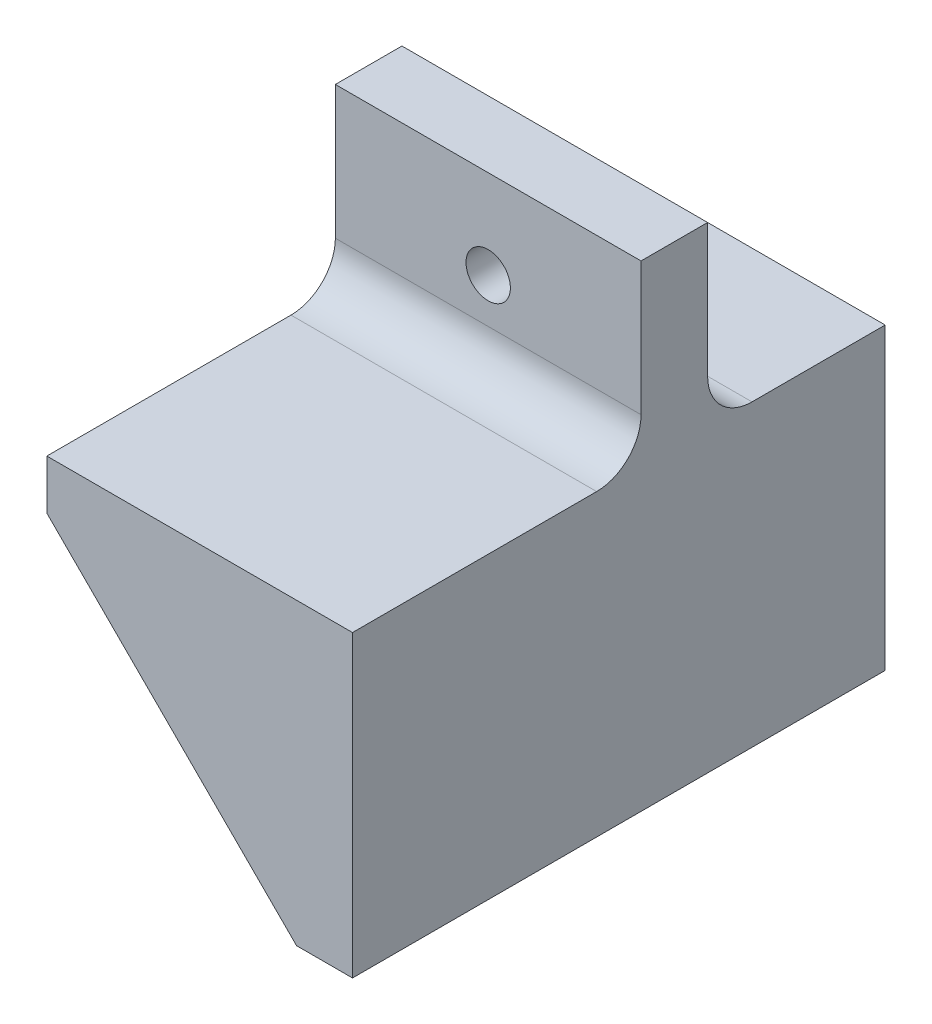
ISO-10303-21;
HEADER;
FILE_DESCRIPTION(('STEP AP214'),'2;1');
FILE_NAME('part.step','',(''),(''),'','','');
FILE_SCHEMA(('AUTOMOTIVE_DESIGN { 1 0 10303 214 1 1 1 1 }'));
ENDSEC;
DATA;
#1=APPLICATION_CONTEXT('core data for automotive mechanical design processes');
#2=APPLICATION_PROTOCOL_DEFINITION('international standard','automotive_design',2000,#1);
#3=PRODUCT_CONTEXT('',#1,'mechanical');
#4=PRODUCT('Part','Part','',(#3));
#5=PRODUCT_RELATED_PRODUCT_CATEGORY('part','',(#4));
#6=PRODUCT_DEFINITION_FORMATION('','',#4);
#7=PRODUCT_DEFINITION_CONTEXT('part definition',#1,'design');
#8=PRODUCT_DEFINITION('design','',#6,#7);
#9=PRODUCT_DEFINITION_SHAPE('','',#8);
#10=(LENGTH_UNIT() NAMED_UNIT(*) SI_UNIT(.MILLI.,.METRE.));
#11=(NAMED_UNIT(*) PLANE_ANGLE_UNIT() SI_UNIT($,.RADIAN.));
#12=(NAMED_UNIT(*) SI_UNIT($,.STERADIAN.) SOLID_ANGLE_UNIT());
#13=UNCERTAINTY_MEASURE_WITH_UNIT(LENGTH_MEASURE(1.E-05),#10,'distance_accuracy_value','');
#14=(GEOMETRIC_REPRESENTATION_CONTEXT(3) GLOBAL_UNCERTAINTY_ASSIGNED_CONTEXT((#13)) GLOBAL_UNIT_ASSIGNED_CONTEXT((#10,
#11,#12)) REPRESENTATION_CONTEXT('',''));
#15=CARTESIAN_POINT('',(0.,0.,0.));
#16=DIRECTION('',(0.,0.,1.));
#17=DIRECTION('',(1.,0.,0.));
#18=AXIS2_PLACEMENT_3D('',#15,#16,#17);
#19=CARTESIAN_POINT('',(-19.9589678162416,21.0060806108814,76.2));
#20=DIRECTION('',(0.,-1.,0.));
#21=DIRECTION('',(0.,0.,1.));
#22=AXIS2_PLACEMENT_3D('',#19,#20,#21);
#23=PLANE('',#22);
#24=CARTESIAN_POINT('',(8.97656608969118,21.0060806108814,12.7));
#25=DIRECTION('',(0.,1.,0.));
#26=DIRECTION('',(0.,0.,1.));
#27=AXIS2_PLACEMENT_3D('',#24,#25,#26);
#28=CIRCLE('',#27,3.17499999999999);
#29=CARTESIAN_POINT('',(8.97656608969118,21.0060806108814,15.875));
#30=VERTEX_POINT('',#29);
#31=EDGE_CURVE('E197',#30,#30,#28,.T.);
#32=ORIENTED_EDGE('',*,*,#31,.F.);
#33=EDGE_LOOP('',(#32));
#34=FACE_BOUND('',#33,.T.);
#35=DIRECTION('',(0.,0.,-1.));
#36=VECTOR('',#35,1.);
#37=CARTESIAN_POINT('',(30.8410321837584,21.0060806108814,76.2));
#38=LINE('',#37,#36);
#39=CARTESIAN_POINT('',(30.8410321837584,21.0060806108814,19.05));
#40=VERTEX_POINT('',#39);
#41=CARTESIAN_POINT('',(30.8410321837584,21.0060806108814,0.));
#42=VERTEX_POINT('',#41);
#43=EDGE_CURVE('E235',#40,#42,#38,.T.);
#44=ORIENTED_EDGE('',*,*,#43,.T.);
#45=DIRECTION('',(1.,0.,0.));
#46=VECTOR('',#45,1.);
#47=CARTESIAN_POINT('',(-19.9589678162416,21.0060806108814,0.));
#48=LINE('',#47,#46);
#49=CARTESIAN_POINT('',(-12.8879000043761,21.0060806108814,0.));
#50=VERTEX_POINT('',#49);
#51=EDGE_CURVE('E227',#50,#42,#48,.T.);
#52=ORIENTED_EDGE('',*,*,#51,.F.);
#53=DIRECTION('',(0.,0.,-1.));
#54=VECTOR('',#53,1.);
#55=CARTESIAN_POINT('',(-12.8879000043761,21.0060806108814,76.2));
#56=LINE('',#55,#54);
#57=CARTESIAN_POINT('',(-12.8879000043761,21.0060806108814,19.05));
#58=VERTEX_POINT('',#57);
#59=EDGE_CURVE('E289',#58,#50,#56,.T.);
#60=ORIENTED_EDGE('',*,*,#59,.F.);
#61=DIRECTION('',(1.,0.,0.));
#62=VECTOR('',#61,1.);
#63=CARTESIAN_POINT('',(-12.8879000043761,21.0060806108814,19.05));
#64=LINE('',#63,#62);
#65=EDGE_CURVE('E307',#40,#58,#64,.F.);
#66=ORIENTED_EDGE('',*,*,#65,.F.);
#67=EDGE_LOOP('',(#44,#52,#60,#66));
#68=FACE_BOUND('',#67,.T.);
#69=ADVANCED_FACE('F44',(#34,#68),#23,.F.);
#70=CARTESIAN_POINT('',(-12.8879000043761,21.0060806108814,76.2));
#71=VERTEX_POINT('',#70);
#72=CARTESIAN_POINT('',(-12.8879000043761,21.0060806108814,41.275));
#73=VERTEX_POINT('',#72);
#74=EDGE_CURVE('E290',#71,#73,#56,.T.);
#75=ORIENTED_EDGE('',*,*,#74,.F.);
#76=DIRECTION('',(1.,0.,0.));
#77=VECTOR('',#76,1.);
#78=CARTESIAN_POINT('',(-19.9589678162416,21.0060806108814,76.2));
#79=LINE('',#78,#77);
#80=CARTESIAN_POINT('',(30.8410321837584,21.0060806108814,76.2));
#81=VERTEX_POINT('',#80);
#82=EDGE_CURVE('E231',#71,#81,#79,.T.);
#83=ORIENTED_EDGE('',*,*,#82,.T.);
#84=CARTESIAN_POINT('',(30.8410321837584,21.0060806108814,41.275));
#85=VERTEX_POINT('',#84);
#86=EDGE_CURVE('E246',#81,#85,#38,.T.);
#87=ORIENTED_EDGE('',*,*,#86,.T.);
#88=DIRECTION('',(-1.,0.,0.));
#89=VECTOR('',#88,1.);
#90=CARTESIAN_POINT('',(30.8410321837584,21.0060806108814,41.275));
#91=LINE('',#90,#89);
#92=EDGE_CURVE('E313',#73,#85,#91,.F.);
#93=ORIENTED_EDGE('',*,*,#92,.F.);
#94=EDGE_LOOP('',(#75,#83,#87,#93));
#95=FACE_BOUND('',#94,.T.);
#96=ADVANCED_FACE('F347',(#95),#23,.F.);
#97=CARTESIAN_POINT('',(30.8410321837584,-29.7939193891186,76.2));
#98=DIRECTION('',(-1.,0.,0.));
#99=DIRECTION('',(0.,1.,0.));
#100=AXIS2_PLACEMENT_3D('',#97,#98,#99);
#101=PLANE('',#100);
#102=DIRECTION('',(0.,-1.,0.));
#103=VECTOR('',#102,1.);
#104=CARTESIAN_POINT('',(30.8410321837584,-29.7939193891186,0.));
#105=LINE('',#104,#103);
#106=CARTESIAN_POINT('',(30.8410321837584,-21.7939193891185,0.));
#107=VERTEX_POINT('',#106);
#108=EDGE_CURVE('E218',#42,#107,#105,.T.);
#109=ORIENTED_EDGE('',*,*,#108,.F.);
#110=ORIENTED_EDGE('',*,*,#43,.F.);
#111=CARTESIAN_POINT('',(30.8410321837584,27.3560806108814,19.05));
#112=DIRECTION('',(1.,0.,0.));
#113=DIRECTION('',(0.,1.,0.));
#114=AXIS2_PLACEMENT_3D('',#111,#112,#113);
#115=CIRCLE('',#114,6.35);
#116=CARTESIAN_POINT('',(30.8410321837584,27.3560806108814,25.4));
#117=VERTEX_POINT('',#116);
#118=EDGE_CURVE('E316',#117,#40,#115,.T.);
#119=ORIENTED_EDGE('',*,*,#118,.F.);
#120=DIRECTION('',(0.,-1.,0.));
#121=VECTOR('',#120,1.);
#122=CARTESIAN_POINT('',(30.8410321837584,46.4060806108814,25.4));
#123=LINE('',#122,#121);
#124=CARTESIAN_POINT('',(30.8410321837584,46.4060806108814,25.4));
#125=VERTEX_POINT('',#124);
#126=EDGE_CURVE('E174',#125,#117,#123,.T.);
#127=ORIENTED_EDGE('',*,*,#126,.F.);
#128=DIRECTION('',(0.,0.,1.));
#129=VECTOR('',#128,1.);
#130=CARTESIAN_POINT('',(30.8410321837584,46.4060806108814,25.4));
#131=LINE('',#130,#129);
#132=CARTESIAN_POINT('',(30.8410321837584,46.4060806108814,34.925));
#133=VERTEX_POINT('',#132);
#134=EDGE_CURVE('E155',#125,#133,#131,.T.);
#135=ORIENTED_EDGE('',*,*,#134,.T.);
#136=DIRECTION('',(0.,-1.,0.));
#137=VECTOR('',#136,1.);
#138=CARTESIAN_POINT('',(30.8410321837584,46.4060806108814,34.925));
#139=LINE('',#138,#137);
#140=CARTESIAN_POINT('',(30.8410321837584,27.3560806108814,34.925));
#141=VERTEX_POINT('',#140);
#142=EDGE_CURVE('E164',#133,#141,#139,.T.);
#143=ORIENTED_EDGE('',*,*,#142,.T.);
#144=CARTESIAN_POINT('',(30.8410321837584,27.3560806108814,41.275));
#145=DIRECTION('',(1.,0.,0.));
#146=DIRECTION('',(0.,1.,0.));
#147=AXIS2_PLACEMENT_3D('',#144,#145,#146);
#148=CIRCLE('',#147,6.35);
#149=EDGE_CURVE('E11',#85,#141,#148,.T.);
#150=ORIENTED_EDGE('',*,*,#149,.F.);
#151=ORIENTED_EDGE('',*,*,#86,.F.);
#152=DIRECTION('',(0.,-1.,0.));
#153=VECTOR('',#152,1.);
#154=CARTESIAN_POINT('',(30.8410321837584,-29.7939193891186,76.2));
#155=LINE('',#154,#153);
#156=CARTESIAN_POINT('',(30.8410321837584,-21.7939193891185,76.2));
#157=VERTEX_POINT('',#156);
#158=EDGE_CURVE('E222',#81,#157,#155,.T.);
#159=ORIENTED_EDGE('',*,*,#158,.T.);
#160=DIRECTION('',(0.,0.,1.));
#161=VECTOR('',#160,1.);
#162=CARTESIAN_POINT('',(30.8410321837584,-21.7939193891185,76.2));
#163=LINE('',#162,#161);
#164=EDGE_CURVE('E282',#107,#157,#163,.T.);
#165=ORIENTED_EDGE('',*,*,#164,.F.);
#166=EDGE_LOOP('',(#109,#110,#119,#127,#135,#143,#150,#151,#159,#165));
#167=FACE_BOUND('',#166,.T.);
#168=ADVANCED_FACE('F171',(#167),#101,.F.);
#169=CARTESIAN_POINT('',(30.8410321837584,-29.7939193891186,76.2));
#170=DIRECTION('',(0.707106781186548,0.707106781186547,0.));
#171=DIRECTION('',(0.707106781186547,-0.707106781186548,0.));
#172=AXIS2_PLACEMENT_3D('',#169,#170,#171);
#173=PLANE('',#172);
#174=DIRECTION('',(-0.707106781186547,0.707106781186548,0.));
#175=VECTOR('',#174,1.);
#176=CARTESIAN_POINT('',(30.8410321837584,-29.7939193891186,0.));
#177=LINE('',#176,#175);
#178=CARTESIAN_POINT('',(22.8410321837583,-21.7939193891185,0.));
#179=VERTEX_POINT('',#178);
#180=CARTESIAN_POINT('',(-12.8879000043761,13.9350127990159,0.));
#181=VERTEX_POINT('',#180);
#182=EDGE_CURVE('E239',#179,#181,#177,.T.);
#183=ORIENTED_EDGE('',*,*,#182,.F.);
#184=DIRECTION('',(0.,0.,-1.));
#185=VECTOR('',#184,1.);
#186=CARTESIAN_POINT('',(22.8410321837583,-21.7939193891185,76.2));
#187=LINE('',#186,#185);
#188=CARTESIAN_POINT('',(22.8410321837583,-21.7939193891185,4.57200000000001));
#189=VERTEX_POINT('',#188);
#190=EDGE_CURVE('E262',#189,#179,#187,.T.);
#191=ORIENTED_EDGE('',*,*,#190,.F.);
#192=DIRECTION('',(0.707106781186547,-0.707106781186548,0.));
#193=VECTOR('',#192,1.);
#194=CARTESIAN_POINT('',(30.8410321837584,-29.7939193891186,4.57200000000001));
#195=LINE('',#194,#193);
#196=CARTESIAN_POINT('',(-10.0318871453602,11.07899994,4.57200000000001));
#197=VERTEX_POINT('',#196);
#198=EDGE_CURVE('E258',#197,#189,#195,.T.);
#199=ORIENTED_EDGE('',*,*,#198,.F.);
#200=DIRECTION('',(0.,0.,1.));
#201=VECTOR('',#200,1.);
#202=CARTESIAN_POINT('',(-10.0318871453602,11.07899994,76.2));
#203=LINE('',#202,#201);
#204=CARTESIAN_POINT('',(-10.0318871453602,11.07899994,71.628));
#205=VERTEX_POINT('',#204);
#206=EDGE_CURVE('E250',#197,#205,#203,.T.);
#207=ORIENTED_EDGE('',*,*,#206,.T.);
#208=DIRECTION('',(-0.707106781186547,0.707106781186548,0.));
#209=VECTOR('',#208,1.);
#210=CARTESIAN_POINT('',(30.8410321837584,-29.7939193891186,71.628));
#211=LINE('',#210,#209);
#212=CARTESIAN_POINT('',(22.8410321837583,-21.7939193891185,71.628));
#213=VERTEX_POINT('',#212);
#214=EDGE_CURVE('E254',#213,#205,#211,.T.);
#215=ORIENTED_EDGE('',*,*,#214,.F.);
#216=DIRECTION('',(0.,0.,-1.));
#217=VECTOR('',#216,1.);
#218=CARTESIAN_POINT('',(22.8410321837583,-21.7939193891185,76.2));
#219=LINE('',#218,#217);
#220=CARTESIAN_POINT('',(22.8410321837583,-21.7939193891185,76.2));
#221=VERTEX_POINT('',#220);
#222=EDGE_CURVE('E266',#221,#213,#219,.T.);
#223=ORIENTED_EDGE('',*,*,#222,.F.);
#224=DIRECTION('',(-0.707106781186547,0.707106781186548,0.));
#225=VECTOR('',#224,1.);
#226=CARTESIAN_POINT('',(30.8410321837584,-29.7939193891186,76.2));
#227=LINE('',#226,#225);
#228=CARTESIAN_POINT('',(-12.8879000043761,13.9350127990159,76.2));
#229=VERTEX_POINT('',#228);
#230=EDGE_CURVE('E226',#221,#229,#227,.T.);
#231=ORIENTED_EDGE('',*,*,#230,.T.);
#232=DIRECTION('',(0.,0.,1.));
#233=VECTOR('',#232,1.);
#234=CARTESIAN_POINT('',(-12.8879000043761,13.9350127990159,76.2));
#235=LINE('',#234,#233);
#236=EDGE_CURVE('E297',#181,#229,#235,.T.);
#237=ORIENTED_EDGE('',*,*,#236,.F.);
#238=EDGE_LOOP('',(#183,#191,#199,#207,#215,#223,#231,#237));
#239=FACE_BOUND('',#238,.T.);
#240=ADVANCED_FACE('F363',(#239),#173,.F.);
#241=CARTESIAN_POINT('',(0.,0.,76.2));
#242=DIRECTION('',(0.,0.,1.));
#243=DIRECTION('',(1.,0.,0.));
#244=AXIS2_PLACEMENT_3D('',#241,#242,#243);
#245=PLANE('',#244);
#246=ORIENTED_EDGE('',*,*,#230,.F.);
#247=DIRECTION('',(1.,0.,0.));
#248=VECTOR('',#247,1.);
#249=CARTESIAN_POINT('',(0.,-21.7939193891185,76.2));
#250=LINE('',#249,#248);
#251=EDGE_CURVE('E286',#157,#221,#250,.F.);
#252=ORIENTED_EDGE('',*,*,#251,.F.);
#253=ORIENTED_EDGE('',*,*,#158,.F.);
#254=ORIENTED_EDGE('',*,*,#82,.F.);
#255=DIRECTION('',(0.,-1.,0.));
#256=VECTOR('',#255,1.);
#257=CARTESIAN_POINT('',(-12.8879000043761,0.,76.2));
#258=LINE('',#257,#256);
#259=EDGE_CURVE('E301',#229,#71,#258,.F.);
#260=ORIENTED_EDGE('',*,*,#259,.F.);
#261=EDGE_LOOP('',(#246,#252,#253,#254,#260));
#262=FACE_BOUND('',#261,.T.);
#263=ADVANCED_FACE('F366',(#262),#245,.T.);
#264=CARTESIAN_POINT('',(0.,0.,0.));
#265=DIRECTION('',(0.,0.,1.));
#266=DIRECTION('',(1.,0.,0.));
#267=AXIS2_PLACEMENT_3D('',#264,#265,#266);
#268=PLANE('',#267);
#269=ORIENTED_EDGE('',*,*,#51,.T.);
#270=ORIENTED_EDGE('',*,*,#108,.T.);
#271=DIRECTION('',(-1.,0.,0.));
#272=VECTOR('',#271,1.);
#273=CARTESIAN_POINT('',(22.8410321837583,-21.7939193891185,0.));
#274=LINE('',#273,#272);
#275=EDGE_CURVE('E279',#179,#107,#274,.F.);
#276=ORIENTED_EDGE('',*,*,#275,.F.);
#277=ORIENTED_EDGE('',*,*,#182,.T.);
#278=DIRECTION('',(0.,1.,0.));
#279=VECTOR('',#278,1.);
#280=CARTESIAN_POINT('',(-12.8879000043761,21.0060806108814,0.));
#281=LINE('',#280,#279);
#282=EDGE_CURVE('E294',#50,#181,#281,.F.);
#283=ORIENTED_EDGE('',*,*,#282,.F.);
#284=EDGE_LOOP('',(#269,#270,#276,#277,#283));
#285=FACE_BOUND('',#284,.T.);
#286=ADVANCED_FACE('F334',(#285),#268,.F.);
#287=CARTESIAN_POINT('',(-19.9589678162416,11.07899994,4.572));
#288=DIRECTION('',(0.,0.,-1.));
#289=DIRECTION('',(-1.,0.,0.));
#290=AXIS2_PLACEMENT_3D('',#287,#288,#289);
#291=PLANE('',#290);
#292=DIRECTION('',(0.,-1.,0.));
#293=VECTOR('',#292,1.);
#294=CARTESIAN_POINT('',(26.2690321837584,11.07899994,4.572));
#295=LINE('',#294,#293);
#296=CARTESIAN_POINT('',(26.2690321837584,11.07899994,4.572));
#297=VERTEX_POINT('',#296);
#298=CARTESIAN_POINT('',(26.2690321837584,-21.7939193891185,4.572));
#299=VERTEX_POINT('',#298);
#300=EDGE_CURVE('E214',#297,#299,#295,.T.);
#301=ORIENTED_EDGE('',*,*,#300,.F.);
#302=DIRECTION('',(-1.,0.,0.));
#303=VECTOR('',#302,1.);
#304=CARTESIAN_POINT('',(-19.9589678162416,11.07899994,4.572));
#305=LINE('',#304,#303);
#306=EDGE_CURVE('E210',#297,#197,#305,.T.);
#307=ORIENTED_EDGE('',*,*,#306,.T.);
#308=ORIENTED_EDGE('',*,*,#198,.T.);
#309=DIRECTION('',(1.,0.,0.));
#310=VECTOR('',#309,1.);
#311=CARTESIAN_POINT('',(22.8410321837583,-21.7939193891185,4.57200000000001));
#312=LINE('',#311,#310);
#313=EDGE_CURVE('E276',#299,#189,#312,.F.);
#314=ORIENTED_EDGE('',*,*,#313,.F.);
#315=EDGE_LOOP('',(#301,#307,#308,#314));
#316=FACE_BOUND('',#315,.T.);
#317=ADVANCED_FACE('F394',(#316),#291,.F.);
#318=CARTESIAN_POINT('',(26.2690321837584,11.07899994,4.572));
#319=DIRECTION('',(1.,0.,0.));
#320=DIRECTION('',(0.,0.,-1.));
#321=AXIS2_PLACEMENT_3D('',#318,#319,#320);
#322=PLANE('',#321);
#323=DIRECTION('',(0.,-1.,0.));
#324=VECTOR('',#323,1.);
#325=CARTESIAN_POINT('',(26.2690321837584,11.07899994,71.628));
#326=LINE('',#325,#324);
#327=CARTESIAN_POINT('',(26.2690321837584,11.07899994,71.628));
#328=VERTEX_POINT('',#327);
#329=CARTESIAN_POINT('',(26.2690321837584,-21.7939193891185,71.628));
#330=VERTEX_POINT('',#329);
#331=EDGE_CURVE('E213',#328,#330,#326,.T.);
#332=ORIENTED_EDGE('',*,*,#331,.F.);
#333=DIRECTION('',(0.,0.,-1.));
#334=VECTOR('',#333,1.);
#335=CARTESIAN_POINT('',(26.2690321837584,11.07899994,4.572));
#336=LINE('',#335,#334);
#337=EDGE_CURVE('E207',#328,#297,#336,.T.);
#338=ORIENTED_EDGE('',*,*,#337,.T.);
#339=ORIENTED_EDGE('',*,*,#300,.T.);
#340=DIRECTION('',(0.,0.,1.));
#341=VECTOR('',#340,1.);
#342=CARTESIAN_POINT('',(26.2690321837584,-21.7939193891185,76.2));
#343=LINE('',#342,#341);
#344=EDGE_CURVE('E273',#330,#299,#343,.F.);
#345=ORIENTED_EDGE('',*,*,#344,.F.);
#346=EDGE_LOOP('',(#332,#338,#339,#345));
#347=FACE_BOUND('',#346,.T.);
#348=ADVANCED_FACE('F397',(#347),#322,.F.);
#349=CARTESIAN_POINT('',(-19.9589678162415,11.07899994,71.628));
#350=DIRECTION('',(0.,0.,1.));
#351=DIRECTION('',(1.,0.,0.));
#352=AXIS2_PLACEMENT_3D('',#349,#350,#351);
#353=PLANE('',#352);
#354=ORIENTED_EDGE('',*,*,#214,.T.);
#355=DIRECTION('',(1.,0.,0.));
#356=VECTOR('',#355,1.);
#357=CARTESIAN_POINT('',(-19.9589678162415,11.07899994,71.628));
#358=LINE('',#357,#356);
#359=EDGE_CURVE('E201',#205,#328,#358,.T.);
#360=ORIENTED_EDGE('',*,*,#359,.T.);
#361=ORIENTED_EDGE('',*,*,#331,.T.);
#362=DIRECTION('',(-1.,0.,0.));
#363=VECTOR('',#362,1.);
#364=CARTESIAN_POINT('',(22.8410321837583,-21.7939193891185,71.628));
#365=LINE('',#364,#363);
#366=EDGE_CURVE('E270',#213,#330,#365,.F.);
#367=ORIENTED_EDGE('',*,*,#366,.F.);
#368=EDGE_LOOP('',(#354,#360,#361,#367));
#369=FACE_BOUND('',#368,.T.);
#370=ADVANCED_FACE('F392',(#369),#353,.F.);
#371=CARTESIAN_POINT('',(0.,11.07899994,0.));
#372=DIRECTION('',(0.,-1.,0.));
#373=DIRECTION('',(0.,0.,1.));
#374=AXIS2_PLACEMENT_3D('',#371,#372,#373);
#375=PLANE('',#374);
#376=CARTESIAN_POINT('',(8.97656608969118,11.07899994,12.7));
#377=DIRECTION('',(0.,1.,0.));
#378=DIRECTION('',(0.,0.,1.));
#379=AXIS2_PLACEMENT_3D('',#376,#377,#378);
#380=CIRCLE('',#379,3.17499999999999);
#381=CARTESIAN_POINT('',(8.97656608969118,11.07899994,15.875));
#382=VERTEX_POINT('',#381);
#383=EDGE_CURVE('E168',#382,#382,#380,.T.);
#384=ORIENTED_EDGE('',*,*,#383,.T.);
#385=EDGE_LOOP('',(#384));
#386=FACE_BOUND('',#385,.T.);
#387=ORIENTED_EDGE('',*,*,#206,.F.);
#388=ORIENTED_EDGE('',*,*,#306,.F.);
#389=ORIENTED_EDGE('',*,*,#337,.F.);
#390=ORIENTED_EDGE('',*,*,#359,.F.);
#391=EDGE_LOOP('',(#387,#388,#389,#390));
#392=FACE_BOUND('',#391,.T.);
#393=ADVANCED_FACE('F373',(#386,#392),#375,.T.);
#394=CARTESIAN_POINT('',(22.8410321837583,-21.7939193891185,76.2));
#395=DIRECTION('',(0.,1.,0.));
#396=DIRECTION('',(0.,0.,-1.));
#397=AXIS2_PLACEMENT_3D('',#394,#395,#396);
#398=PLANE('',#397);
#399=ORIENTED_EDGE('',*,*,#251,.T.);
#400=ORIENTED_EDGE('',*,*,#222,.T.);
#401=ORIENTED_EDGE('',*,*,#366,.T.);
#402=ORIENTED_EDGE('',*,*,#344,.T.);
#403=ORIENTED_EDGE('',*,*,#313,.T.);
#404=ORIENTED_EDGE('',*,*,#190,.T.);
#405=ORIENTED_EDGE('',*,*,#275,.T.);
#406=ORIENTED_EDGE('',*,*,#164,.T.);
#407=EDGE_LOOP('',(#399,#400,#401,#402,#403,#404,#405,#406));
#408=FACE_BOUND('',#407,.T.);
#409=ADVANCED_FACE('F370',(#408),#398,.F.);
#410=CARTESIAN_POINT('',(-12.8879000043761,21.0060806108814,76.2));
#411=DIRECTION('',(1.,0.,0.));
#412=DIRECTION('',(0.,0.,-1.));
#413=AXIS2_PLACEMENT_3D('',#410,#411,#412);
#414=PLANE('',#413);
#415=ORIENTED_EDGE('',*,*,#259,.T.);
#416=ORIENTED_EDGE('',*,*,#74,.T.);
#417=CARTESIAN_POINT('',(-12.887900004376,27.3560806108814,41.275));
#418=DIRECTION('',(-1.,0.,0.));
#419=DIRECTION('',(0.,-1.,0.));
#420=AXIS2_PLACEMENT_3D('',#417,#418,#419);
#421=CIRCLE('',#420,6.35);
#422=CARTESIAN_POINT('',(-12.8879000043761,27.3560806108814,34.925));
#423=VERTEX_POINT('',#422);
#424=EDGE_CURVE('E53',#423,#73,#421,.T.);
#425=ORIENTED_EDGE('',*,*,#424,.F.);
#426=DIRECTION('',(0.,-1.,0.));
#427=VECTOR('',#426,1.);
#428=CARTESIAN_POINT('',(-12.8879000043761,46.4060806108814,34.925));
#429=LINE('',#428,#427);
#430=CARTESIAN_POINT('',(-12.8879000043761,46.4060806108814,34.925));
#431=VERTEX_POINT('',#430);
#432=EDGE_CURVE('E169',#431,#423,#429,.T.);
#433=ORIENTED_EDGE('',*,*,#432,.F.);
#434=DIRECTION('',(0.,0.,-1.));
#435=VECTOR('',#434,1.);
#436=CARTESIAN_POINT('',(-12.8879000043761,46.4060806108814,25.4));
#437=LINE('',#436,#435);
#438=CARTESIAN_POINT('',(-12.8879000043761,46.4060806108814,25.4));
#439=VERTEX_POINT('',#438);
#440=EDGE_CURVE('E158',#431,#439,#437,.T.);
#441=ORIENTED_EDGE('',*,*,#440,.T.);
#442=DIRECTION('',(0.,-1.,0.));
#443=VECTOR('',#442,1.);
#444=CARTESIAN_POINT('',(-12.8879000043761,46.4060806108814,25.4));
#445=LINE('',#444,#443);
#446=CARTESIAN_POINT('',(-12.8879000043761,27.3560806108814,25.4));
#447=VERTEX_POINT('',#446);
#448=EDGE_CURVE('E191',#439,#447,#445,.T.);
#449=ORIENTED_EDGE('',*,*,#448,.T.);
#450=CARTESIAN_POINT('',(-12.887900004376,27.3560806108814,19.05));
#451=DIRECTION('',(-1.,0.,0.));
#452=DIRECTION('',(0.,-1.,0.));
#453=AXIS2_PLACEMENT_3D('',#450,#451,#452);
#454=CIRCLE('',#453,6.35);
#455=EDGE_CURVE('E319',#58,#447,#454,.T.);
#456=ORIENTED_EDGE('',*,*,#455,.F.);
#457=ORIENTED_EDGE('',*,*,#59,.T.);
#458=ORIENTED_EDGE('',*,*,#282,.T.);
#459=ORIENTED_EDGE('',*,*,#236,.T.);
#460=EDGE_LOOP('',(#415,#416,#425,#433,#441,#449,#456,#457,#458,#459));
#461=FACE_BOUND('',#460,.T.);
#462=ADVANCED_FACE('F338',(#461),#414,.F.);
#463=CARTESIAN_POINT('',(8.97656608969118,21.0060806108814,12.7));
#464=DIRECTION('',(0.,-1.,0.));
#465=DIRECTION('',(0.,0.,1.));
#466=AXIS2_PLACEMENT_3D('',#463,#464,#465);
#467=CYLINDRICAL_SURFACE('',#466,3.17499999999999);
#468=ORIENTED_EDGE('',*,*,#31,.T.);
#469=EDGE_LOOP('',(#468));
#470=FACE_BOUND('',#469,.T.);
#471=ORIENTED_EDGE('',*,*,#383,.F.);
#472=EDGE_LOOP('',(#471));
#473=FACE_BOUND('',#472,.T.);
#474=ADVANCED_FACE('F376',(#470,#473),#467,.F.);
#475=CARTESIAN_POINT('',(-12.8879000043761,46.4060806108814,34.925));
#476=DIRECTION('',(0.,0.,-1.));
#477=DIRECTION('',(-1.,0.,0.));
#478=AXIS2_PLACEMENT_3D('',#475,#476,#477);
#479=PLANE('',#478);
#480=CARTESIAN_POINT('',(8.97656608969118,33.7060806108814,34.925));
#481=DIRECTION('',(0.,0.,-1.));
#482=DIRECTION('',(1.,0.,0.));
#483=AXIS2_PLACEMENT_3D('',#480,#481,#482);
#484=CIRCLE('',#483,3.17500000000001);
#485=CARTESIAN_POINT('',(12.1515660896912,33.7060806108814,34.925));
#486=VERTEX_POINT('',#485);
#487=EDGE_CURVE('E180',#486,#486,#484,.T.);
#488=ORIENTED_EDGE('',*,*,#487,.T.);
#489=EDGE_LOOP('',(#488));
#490=FACE_BOUND('',#489,.T.);
#491=ORIENTED_EDGE('',*,*,#142,.F.);
#492=DIRECTION('',(-1.,0.,0.));
#493=VECTOR('',#492,1.);
#494=CARTESIAN_POINT('',(-12.8879000043761,46.4060806108814,34.925));
#495=LINE('',#494,#493);
#496=EDGE_CURVE('E151',#133,#431,#495,.T.);
#497=ORIENTED_EDGE('',*,*,#496,.T.);
#498=ORIENTED_EDGE('',*,*,#432,.T.);
#499=DIRECTION('',(-1.,0.,0.));
#500=VECTOR('',#499,1.);
#501=CARTESIAN_POINT('',(-12.8879000043761,27.3560806108814,34.925));
#502=LINE('',#501,#500);
#503=EDGE_CURVE('E166',#141,#423,#502,.T.);
#504=ORIENTED_EDGE('',*,*,#503,.F.);
#505=EDGE_LOOP('',(#491,#497,#498,#504));
#506=FACE_BOUND('',#505,.T.);
#507=ADVANCED_FACE('F165',(#490,#506),#479,.F.);
#508=CARTESIAN_POINT('',(-12.8879000043761,46.4060806108814,25.4));
#509=DIRECTION('',(0.,0.,1.));
#510=DIRECTION('',(1.,0.,0.));
#511=AXIS2_PLACEMENT_3D('',#508,#509,#510);
#512=PLANE('',#511);
#513=CARTESIAN_POINT('',(8.97656608969118,33.7060806108814,25.4));
#514=DIRECTION('',(0.,0.,-1.));
#515=DIRECTION('',(1.,0.,0.));
#516=AXIS2_PLACEMENT_3D('',#513,#514,#515);
#517=CIRCLE('',#516,3.17500000000001);
#518=CARTESIAN_POINT('',(12.1515660896912,33.7060806108814,25.4));
#519=VERTEX_POINT('',#518);
#520=EDGE_CURVE('E176',#519,#519,#517,.T.);
#521=ORIENTED_EDGE('',*,*,#520,.F.);
#522=EDGE_LOOP('',(#521));
#523=FACE_BOUND('',#522,.T.);
#524=ORIENTED_EDGE('',*,*,#448,.F.);
#525=DIRECTION('',(1.,0.,0.));
#526=VECTOR('',#525,1.);
#527=CARTESIAN_POINT('',(-12.8879000043761,46.4060806108814,25.4));
#528=LINE('',#527,#526);
#529=EDGE_CURVE('E186',#439,#125,#528,.T.);
#530=ORIENTED_EDGE('',*,*,#529,.T.);
#531=ORIENTED_EDGE('',*,*,#126,.T.);
#532=DIRECTION('',(1.,0.,0.));
#533=VECTOR('',#532,1.);
#534=CARTESIAN_POINT('',(30.8410321837584,27.3560806108814,25.4));
#535=LINE('',#534,#533);
#536=EDGE_CURVE('E303',#447,#117,#535,.T.);
#537=ORIENTED_EDGE('',*,*,#536,.F.);
#538=EDGE_LOOP('',(#524,#530,#531,#537));
#539=FACE_BOUND('',#538,.T.);
#540=ADVANCED_FACE('F343',(#523,#539),#512,.F.);
#541=CARTESIAN_POINT('',(0.,46.4060806108814,0.));
#542=DIRECTION('',(0.,-1.,0.));
#543=DIRECTION('',(0.,0.,1.));
#544=AXIS2_PLACEMENT_3D('',#541,#542,#543);
#545=PLANE('',#544);
#546=ORIENTED_EDGE('',*,*,#134,.F.);
#547=ORIENTED_EDGE('',*,*,#529,.F.);
#548=ORIENTED_EDGE('',*,*,#440,.F.);
#549=ORIENTED_EDGE('',*,*,#496,.F.);
#550=EDGE_LOOP('',(#546,#547,#548,#549));
#551=FACE_BOUND('',#550,.T.);
#552=ADVANCED_FACE('F153',(#551),#545,.F.);
#553=CARTESIAN_POINT('',(8.97656608969118,33.7060806108814,0.));
#554=DIRECTION('',(0.,0.,1.));
#555=DIRECTION('',(1.,0.,0.));
#556=AXIS2_PLACEMENT_3D('',#553,#554,#555);
#557=CYLINDRICAL_SURFACE('',#556,3.17500000000001);
#558=ORIENTED_EDGE('',*,*,#487,.F.);
#559=EDGE_LOOP('',(#558));
#560=FACE_BOUND('',#559,.T.);
#561=ORIENTED_EDGE('',*,*,#520,.T.);
#562=EDGE_LOOP('',(#561));
#563=FACE_BOUND('',#562,.T.);
#564=ADVANCED_FACE('F352',(#560,#563),#557,.F.);
#565=CARTESIAN_POINT('',(-12.8879000043761,27.3560806108814,19.05));
#566=DIRECTION('',(-1.,0.,0.));
#567=DIRECTION('',(0.,0.,1.));
#568=AXIS2_PLACEMENT_3D('',#565,#566,#567);
#569=CYLINDRICAL_SURFACE('',#568,6.35);
#570=ORIENTED_EDGE('',*,*,#455,.T.);
#571=ORIENTED_EDGE('',*,*,#536,.T.);
#572=ORIENTED_EDGE('',*,*,#118,.T.);
#573=ORIENTED_EDGE('',*,*,#65,.T.);
#574=EDGE_LOOP('',(#570,#571,#572,#573));
#575=FACE_BOUND('',#574,.T.);
#576=ADVANCED_FACE('F341',(#575),#569,.F.);
#577=CARTESIAN_POINT('',(-12.8879000043761,27.3560806108814,41.275));
#578=DIRECTION('',(1.,0.,0.));
#579=DIRECTION('',(0.,0.,-1.));
#580=AXIS2_PLACEMENT_3D('',#577,#578,#579);
#581=CYLINDRICAL_SURFACE('',#580,6.35);
#582=ORIENTED_EDGE('',*,*,#149,.T.);
#583=ORIENTED_EDGE('',*,*,#503,.T.);
#584=ORIENTED_EDGE('',*,*,#424,.T.);
#585=ORIENTED_EDGE('',*,*,#92,.T.);
#586=EDGE_LOOP('',(#582,#583,#584,#585));
#587=FACE_BOUND('',#586,.T.);
#588=ADVANCED_FACE('F46',(#587),#581,.F.);
#589=CLOSED_SHELL('',(#69,#96,#168,#240,#263,#286,#317,#348,#370,#393,#409,#462,#474,#507,#540,
#552,#564,#576,#588));
#590=MANIFOLD_SOLID_BREP('B2',#589);
#591=ADVANCED_BREP_SHAPE_REPRESENTATION('',(#18,#590),#14);
#592=SHAPE_DEFINITION_REPRESENTATION(#9,#591);
ENDSEC;
END-ISO-10303-21;
